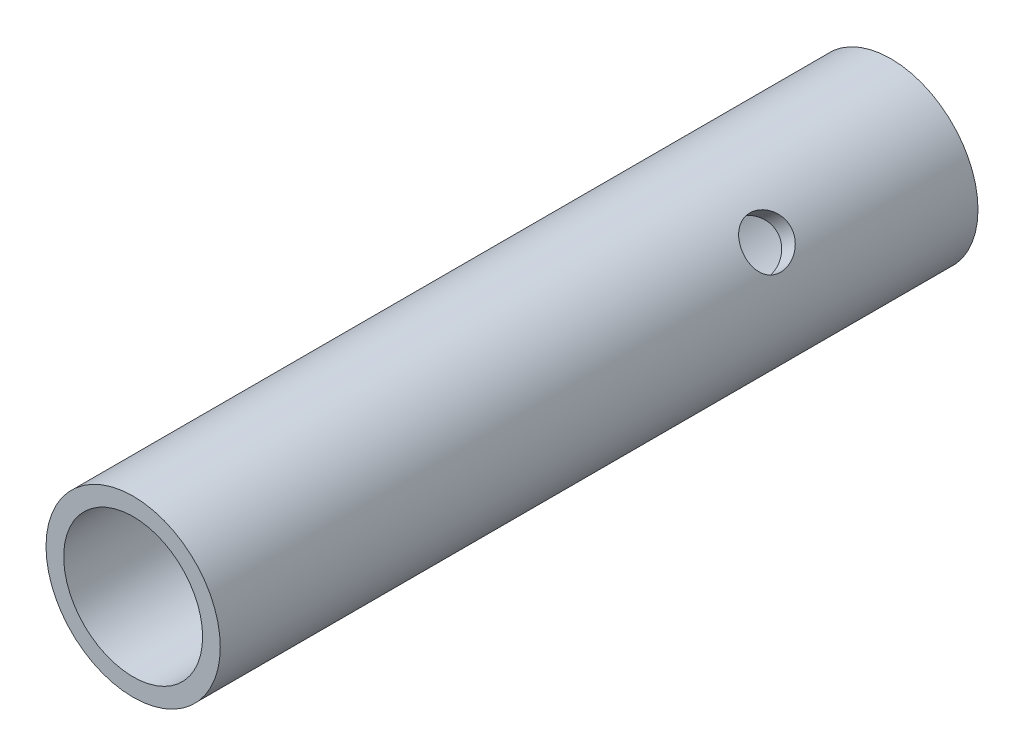
ISO-10303-21;
HEADER;
FILE_DESCRIPTION(('STEP AP214'),'2;1');
FILE_NAME('part.step','',(''),(''),'','','');
FILE_SCHEMA(('AUTOMOTIVE_DESIGN { 1 0 10303 214 1 1 1 1 }'));
ENDSEC;
DATA;
#1=APPLICATION_CONTEXT('core data for automotive mechanical design processes');
#2=APPLICATION_PROTOCOL_DEFINITION('international standard','automotive_design',2000,#1);
#3=PRODUCT_CONTEXT('',#1,'mechanical');
#4=PRODUCT('Part','Part','',(#3));
#5=PRODUCT_RELATED_PRODUCT_CATEGORY('part','',(#4));
#6=PRODUCT_DEFINITION_FORMATION('','',#4);
#7=PRODUCT_DEFINITION_CONTEXT('part definition',#1,'design');
#8=PRODUCT_DEFINITION('design','',#6,#7);
#9=PRODUCT_DEFINITION_SHAPE('','',#8);
#10=(LENGTH_UNIT() NAMED_UNIT(*) SI_UNIT(.MILLI.,.METRE.));
#11=(NAMED_UNIT(*) PLANE_ANGLE_UNIT() SI_UNIT($,.RADIAN.));
#12=(NAMED_UNIT(*) SI_UNIT($,.STERADIAN.) SOLID_ANGLE_UNIT());
#13=UNCERTAINTY_MEASURE_WITH_UNIT(LENGTH_MEASURE(1.E-05),#10,'distance_accuracy_value','');
#14=(GEOMETRIC_REPRESENTATION_CONTEXT(3) GLOBAL_UNCERTAINTY_ASSIGNED_CONTEXT((#13)) GLOBAL_UNIT_ASSIGNED_CONTEXT((#10,
#11,#12)) REPRESENTATION_CONTEXT('',''));
#15=CARTESIAN_POINT('',(0.,0.,0.));
#16=DIRECTION('',(0.,0.,1.));
#17=DIRECTION('',(1.,0.,0.));
#18=AXIS2_PLACEMENT_3D('',#15,#16,#17);
#19=CARTESIAN_POINT('',(0.,0.,76.2));
#20=DIRECTION('',(0.,0.,1.));
#21=DIRECTION('',(1.,0.,0.));
#22=AXIS2_PLACEMENT_3D('',#19,#20,#21);
#23=PLANE('',#22);
#24=CARTESIAN_POINT('',(0.,0.,76.2));
#25=DIRECTION('',(0.,0.,1.));
#26=DIRECTION('',(1.,0.,0.));
#27=AXIS2_PLACEMENT_3D('',#24,#25,#26);
#28=CIRCLE('',#27,17.526);
#29=CARTESIAN_POINT('',(17.526,0.,76.2));
#30=VERTEX_POINT('',#29);
#31=EDGE_CURVE('E10',#30,#30,#28,.T.);
#32=ORIENTED_EDGE('',*,*,#31,.T.);
#33=EDGE_LOOP('',(#32));
#34=FACE_BOUND('',#33,.T.);
#35=CARTESIAN_POINT('',(0.,0.,76.2));
#36=DIRECTION('',(0.,0.,1.));
#37=DIRECTION('',(1.,0.,0.));
#38=AXIS2_PLACEMENT_3D('',#35,#36,#37);
#39=CIRCLE('',#38,13.97);
#40=CARTESIAN_POINT('',(13.97,0.,76.2));
#41=VERTEX_POINT('',#40);
#42=EDGE_CURVE('E56',#41,#41,#39,.T.);
#43=ORIENTED_EDGE('',*,*,#42,.F.);
#44=EDGE_LOOP('',(#43));
#45=FACE_BOUND('',#44,.T.);
#46=ADVANCED_FACE('F37',(#34,#45),#23,.T.);
#47=CARTESIAN_POINT('',(0.,0.,-76.2));
#48=DIRECTION('',(0.,0.,1.));
#49=DIRECTION('',(1.,0.,0.));
#50=AXIS2_PLACEMENT_3D('',#47,#48,#49);
#51=PLANE('',#50);
#52=CARTESIAN_POINT('',(0.,0.,-76.2));
#53=DIRECTION('',(0.,0.,1.));
#54=DIRECTION('',(1.,0.,0.));
#55=AXIS2_PLACEMENT_3D('',#52,#53,#54);
#56=CIRCLE('',#55,17.526);
#57=CARTESIAN_POINT('',(17.526,0.,-76.2));
#58=VERTEX_POINT('',#57);
#59=EDGE_CURVE('E51',#58,#58,#56,.T.);
#60=ORIENTED_EDGE('',*,*,#59,.F.);
#61=EDGE_LOOP('',(#60));
#62=FACE_BOUND('',#61,.T.);
#63=CARTESIAN_POINT('',(0.,0.,-76.2));
#64=DIRECTION('',(0.,0.,1.));
#65=DIRECTION('',(1.,0.,0.));
#66=AXIS2_PLACEMENT_3D('',#63,#64,#65);
#67=CIRCLE('',#66,13.97);
#68=CARTESIAN_POINT('',(13.97,0.,-76.2));
#69=VERTEX_POINT('',#68);
#70=EDGE_CURVE('E59',#69,#69,#67,.T.);
#71=ORIENTED_EDGE('',*,*,#70,.T.);
#72=EDGE_LOOP('',(#71));
#73=FACE_BOUND('',#72,.T.);
#74=ADVANCED_FACE('F95',(#62,#73),#51,.F.);
#75=CARTESIAN_POINT('',(0.,0.,76.2));
#76=DIRECTION('',(0.,0.,-1.));
#77=DIRECTION('',(-1.,0.,0.));
#78=AXIS2_PLACEMENT_3D('',#75,#76,#77);
#79=CYLINDRICAL_SURFACE('',#78,17.526);
#80=CARTESIAN_POINT('',(15.9183936364624,7.3324907115273,-38.1));
#81=CARTESIAN_POINT('',(15.9183930925599,7.33249804726673,-37.8378437978911));
#82=CARTESIAN_POINT('',(15.9089862830615,7.35301934263765,-37.5756256242163));
#83=CARTESIAN_POINT('',(15.8712778914847,7.43405315105421,-37.058775719828));
#84=CARTESIAN_POINT('',(15.8429673022632,7.49458472778479,-36.8041476660481));
#85=CARTESIAN_POINT('',(15.7672929318567,7.65249921997734,-36.310030092278));
#86=CARTESIAN_POINT('',(15.7199566375768,7.74982896024007,-36.0705193071168));
#87=CARTESIAN_POINT('',(15.6059363917525,7.97693580288025,-35.6124304626339));
#88=CARTESIAN_POINT('',(15.5392507268511,8.10671577853537,-35.3938542593179));
#89=CARTESIAN_POINT('',(15.3844543402216,8.39683475617956,-34.978162770671));
#90=CARTESIAN_POINT('',(15.2958774553613,8.5578195575878,-34.78167166091));
#91=CARTESIAN_POINT('',(15.098111566773,8.9020812244723,-34.4212517904443));
#92=CARTESIAN_POINT('',(14.9889203587872,9.08536047311331,-34.2573265158047));
#93=CARTESIAN_POINT('',(14.7484490144502,9.47081311221125,-33.9640732161426));
#94=CARTESIAN_POINT('',(14.61683074508,9.67325071245686,-33.8353680310925));
#95=CARTESIAN_POINT('',(14.3344022715767,10.0870329612848,-33.6202742360598));
#96=CARTESIAN_POINT('',(14.1835954387182,10.2983760408948,-33.5338782055997));
#97=CARTESIAN_POINT('',(13.8695068978694,10.7174797313864,-33.4078818817753));
#98=CARTESIAN_POINT('',(13.70660636971,10.9252062687496,-33.367219276647));
#99=CARTESIAN_POINT('',(13.3694508150897,11.3352930819606,-33.3304994009825));
#100=CARTESIAN_POINT('',(13.1951977644256,11.5376542830134,-33.3344343891762));
#101=CARTESIAN_POINT('',(12.8453087580261,11.925823055095,-33.3860549823937));
#102=CARTESIAN_POINT('',(12.6698284415438,12.111925305076,-33.4325924863652));
#103=CARTESIAN_POINT('',(12.3187684184122,12.4688137192662,-33.5662393010781));
#104=CARTESIAN_POINT('',(12.1431887065807,12.6395989930059,-33.6533509688229));
#105=CARTESIAN_POINT('',(11.7961266218812,12.9641486343006,-33.8665380792009));
#106=CARTESIAN_POINT('',(11.6247043607233,13.117721482505,-33.9930021387805));
#107=CARTESIAN_POINT('',(11.2939589922412,13.4035449682525,-34.2810046917972));
#108=CARTESIAN_POINT('',(11.1346383298484,13.5357913031492,-34.4425502475744));
#109=CARTESIAN_POINT('',(10.8292995474938,13.7813860395458,-34.8022050621307));
#110=CARTESIAN_POINT('',(10.6838666344086,13.8939985018782,-35.0013148900933));
#111=CARTESIAN_POINT('',(10.4185299245743,14.0940625865761,-35.4272934028381));
#112=CARTESIAN_POINT('',(10.2986278105627,14.1815125506122,-35.654163915779));
#113=CARTESIAN_POINT('',(10.0893819345668,14.3311471706364,-36.1313237616136));
#114=CARTESIAN_POINT('',(10.0002456058712,14.3931608345404,-36.3817581099169));
#115=CARTESIAN_POINT('',(9.85848572920605,14.4906320901624,-36.8976685190607));
#116=CARTESIAN_POINT('',(9.80585272472451,14.5260965598752,-37.1631406649347));
#117=CARTESIAN_POINT('',(9.74119760446328,14.5695307437977,-37.6927798924451));
#118=CARTESIAN_POINT('',(9.72796829496044,14.5783179260155,-37.9567327841688));
#119=CARTESIAN_POINT('',(9.73945024401791,14.57064979889,-38.4834228946849));
#120=CARTESIAN_POINT('',(9.76415728760375,14.5541972938396,-38.7461602452787));
#121=CARTESIAN_POINT('',(9.84920025424071,14.4967736642865,-39.2574819443664));
#122=CARTESIAN_POINT('',(9.90880821521915,14.4563032759219,-39.5062447994075));
#123=CARTESIAN_POINT('',(10.0599432522998,14.3515371307781,-39.9885826279048));
#124=CARTESIAN_POINT('',(10.1514746137993,14.2872381751794,-40.2221555572681));
#125=CARTESIAN_POINT('',(10.3645082807385,14.1334788397426,-40.673340331469));
#126=CARTESIAN_POINT('',(10.4866440263067,14.0434801999501,-40.8904692292676));
#127=CARTESIAN_POINT('',(10.7543233530748,13.8395613984205,-41.2973666249077));
#128=CARTESIAN_POINT('',(10.8998715089986,13.7256365602345,-41.4871297617795));
#129=CARTESIAN_POINT('',(11.2131435468648,13.4710047824933,-41.8397888945986));
#130=CARTESIAN_POINT('',(11.3814037577584,13.3295938673013,-42.0017022404634));
#131=CARTESIAN_POINT('',(11.729746472431,13.0241049064826,-42.2868415336025));
#132=CARTESIAN_POINT('',(11.9098283463974,12.8600280678954,-42.4100695398633));
#133=CARTESIAN_POINT('',(12.2735021402586,12.5133681429581,-42.6131942235508));
#134=CARTESIAN_POINT('',(12.4570564585005,12.3309369387468,-42.6934165680787));
#135=CARTESIAN_POINT('',(12.8222898448482,11.9506889237087,-42.8091852102612));
#136=CARTESIAN_POINT('',(13.0039693361337,11.7528756748916,-42.8447418186073));
#137=CARTESIAN_POINT('',(13.3536245482179,11.3538337356235,-42.8695031944559));
#138=CARTESIAN_POINT('',(13.5218523666693,11.1529139860975,-42.8601468022094));
#139=CARTESIAN_POINT('',(13.8460564413466,10.7477771326337,-42.7987029449635));
#140=CARTESIAN_POINT('',(14.0020331891806,10.5435601614028,-42.7466171955586));
#141=CARTESIAN_POINT('',(14.2970963799017,10.1398141309352,-42.6020190396732));
#142=CARTESIAN_POINT('',(14.4362992084145,9.94026157108096,-42.5098084693656));
#143=CARTESIAN_POINT('',(14.6969476087032,9.5506756543249,-42.2878470790421));
#144=CARTESIAN_POINT('',(14.8183906140492,9.36064367582311,-42.1580908414447));
#145=CARTESIAN_POINT('',(15.0454369596559,8.99131926609367,-41.8605660590497));
#146=CARTESIAN_POINT('',(15.1505132067068,8.81246556524288,-41.6918507686252));
#147=CARTESIAN_POINT('',(15.3403086113767,8.47777702707109,-41.322979317669));
#148=CARTESIAN_POINT('',(15.4250223363052,8.32194833705154,-41.1228147900307));
#149=CARTESIAN_POINT('',(15.5758961728976,8.03610081620908,-40.691169981549));
#150=CARTESIAN_POINT('',(15.6415829093265,7.9067607317608,-40.4590735266045));
#151=CARTESIAN_POINT('',(15.7520192230255,7.68440500456603,-39.9735702620458));
#152=CARTESIAN_POINT('',(15.7967819944713,7.59136647701986,-39.7201770009821));
#153=CARTESIAN_POINT('',(15.8603632219613,7.45748821099668,-39.2399056188357));
#154=CARTESIAN_POINT('',(15.8821343849684,7.41077982206922,-39.0150347299666));
#155=CARTESIAN_POINT('',(15.9111489271635,7.34827977641355,-38.5601247085962));
#156=CARTESIAN_POINT('',(15.9183941138284,7.33248427318039,-38.3300862227048));
#157=CARTESIAN_POINT('',(15.9183936364624,7.3324907115273,-38.1));
#158=B_SPLINE_CURVE_WITH_KNOTS('',3,(#80,#81,#82,#83,#84,#85,#86,#87,#88,#89,#90,#91,#92,#93,
#94,#95,#96,#97,#98,#99,#100,#101,#102,#103,#104,#105,#106,#107,#108,#109,#110,#111,#112,#113,
#114,#115,#116,#117,#118,#119,#120,#121,#122,#123,#124,#125,#126,#127,#128,#129,#130,#131,#132,
#133,#134,#135,#136,#137,#138,#139,#140,#141,#142,#143,#144,#145,#146,#147,#148,#149,#150,#151,
#152,#153,#154,#155,#156,#157),.UNSPECIFIED.,.T.,.F.,(4,2,2,2,2,2,2,2,2,2,2,2,2,2,2,2,2,2,2,2,2,
2,2,2,2,2,2,2,2,2,2,2,2,2,2,2,2,2,4),(0.,0.785622172128231,1.57161893947477,2.35648421637042,
3.14141901309959,3.94477838506352,4.74822370770946,5.56507350958325,6.38177999523481,
7.17909647826568,7.97627456487042,8.75258229535404,9.52893512814109,10.3132119696007,
11.0976468423123,11.9070627021408,12.7165318941482,13.5313568098582,14.3459705589724,
15.135356658809,15.9246550590849,16.6980489126388,17.4715466265703,18.2626106758859,
19.0538294852347,19.8689057478766,20.6839386215878,21.4927090772019,22.3012928009558,
23.0841487444215,23.8669732575597,24.6440081624142,25.4211552440202,26.2196621753778,
27.0183819113104,27.8355372362222,28.6521765841629,29.3417781766106,30.03129395615),.UNSPECIFIED.);
#159=CARTESIAN_POINT('',(15.9183936364624,7.3324907115273,-38.1));
#160=VERTEX_POINT('',#159);
#161=EDGE_CURVE('E84',#160,#160,#158,.T.);
#162=ORIENTED_EDGE('',*,*,#161,.T.);
#163=EDGE_LOOP('',(#162));
#164=FACE_BOUND('',#163,.T.);
#165=CARTESIAN_POINT('',(-9.73240097611734,-14.5753575338676,-38.1));
#166=CARTESIAN_POINT('',(-9.73240813645656,-14.575355849099,-38.3621562021088));
#167=CARTESIAN_POINT('',(-9.75120523141671,-14.562854615172,-38.6243743757836));
#168=CARTESIAN_POINT('',(-9.8253424871199,-14.5129339959991,-39.1412242801719));
#169=CARTESIAN_POINT('',(-9.88070006781468,-14.4755027322857,-39.3958523339518));
#170=CARTESIAN_POINT('',(-10.0248322909125,-14.3760567698452,-39.8899699077219));
#171=CARTESIAN_POINT('',(-10.1135587126905,-14.3140775380474,-40.1294806928831));
#172=CARTESIAN_POINT('',(-10.3200327970763,-14.1659337332195,-40.587569537366));
#173=CARTESIAN_POINT('',(-10.4377830295589,-14.0797670184471,-40.806145740682));
#174=CARTESIAN_POINT('',(-10.7001146712308,-13.8814918251411,-41.2218372293289));
#175=CARTESIAN_POINT('',(-10.8452610049968,-13.7688218974304,-41.41832833909));
#176=CARTESIAN_POINT('',(-11.1543468385079,-13.5196364454114,-41.7787482095556));
#177=CARTESIAN_POINT('',(-11.3182883472553,-13.3831183711742,-41.9426734841952));
#178=CARTESIAN_POINT('',(-11.6613774186351,-13.0853095507296,-42.2359267838574));
#179=CARTESIAN_POINT('',(-11.8407330425373,-12.923643502965,-42.3646319689074));
#180=CARTESIAN_POINT('',(-12.2052393980853,-12.5799623878951,-42.5797257639402));
#181=CARTESIAN_POINT('',(-12.3903891074589,-12.3979508958,-42.6661217944002));
#182=CARTESIAN_POINT('',(-12.7551986631949,-12.0221670444707,-42.7921181182247));
#183=CARTESIAN_POINT('',(-12.9348844852034,-11.8287765023837,-42.8327807233529));
#184=CARTESIAN_POINT('',(-13.2871797004213,-11.4316201808737,-42.8695005990175));
#185=CARTESIAN_POINT('',(-13.4597903165278,-11.227856208188,-42.8655656108237));
#186=CARTESIAN_POINT('',(-13.7884453873564,-10.8215519418589,-42.8139450176063));
#187=CARTESIAN_POINT('',(-13.9448052403871,-10.6191192733468,-42.7674075136348));
#188=CARTESIAN_POINT('',(-14.2423818790606,-10.2165517334977,-42.6337606989219));
#189=CARTESIAN_POINT('',(-14.3835977843864,-10.0164169963426,-42.546649031177));
#190=CARTESIAN_POINT('',(-14.6498592094817,-9.62285707230725,-42.333461920799));
#191=CARTESIAN_POINT('',(-14.774724971365,-9.42952121728958,-42.2069978612195));
#192=CARTESIAN_POINT('',(-15.0052895209231,-9.05813522904516,-41.9189953082027));
#193=CARTESIAN_POINT('',(-15.1109844413957,-8.88008818373082,-41.7574497524256));
#194=CARTESIAN_POINT('',(-15.3057899899725,-8.54008914726271,-41.3977949378693));
#195=CARTESIAN_POINT('',(-15.3942652860662,-8.37883028436785,-41.1986851099066));
#196=CARTESIAN_POINT('',(-15.5503584436357,-8.08546339166913,-40.7727065971618));
#197=CARTESIAN_POINT('',(-15.617974930437,-7.95335728330539,-40.5458360842209));
#198=CARTESIAN_POINT('',(-15.733034033311,-7.72327955953166,-40.0686762383864));
#199=CARTESIAN_POINT('',(-15.7803402122115,-7.62553957261753,-39.818241890083));
#200=CARTESIAN_POINT('',(-15.8544353044622,-7.47027713154116,-39.3023314809392));
#201=CARTESIAN_POINT('',(-15.8812295318034,-7.41274426133679,-39.0368593350652));
#202=CARTESIAN_POINT('',(-15.9140146796968,-7.34209054956862,-38.5072201075549));
#203=CARTESIAN_POINT('',(-15.920624157165,-7.3276494966691,-38.2432672158311));
#204=CARTESIAN_POINT('',(-15.9148466099674,-7.34018964324521,-37.7165771053151));
#205=CARTESIAN_POINT('',(-15.9024616957016,-7.36716624095165,-37.4538397547212));
#206=CARTESIAN_POINT('',(-15.8590486973086,-7.4601452223184,-36.9425180556335));
#207=CARTESIAN_POINT('',(-15.8284013060694,-7.52535027393724,-36.6937552005924));
#208=CARTESIAN_POINT('',(-15.7485677346962,-7.69101362378711,-36.2114173720952));
#209=CARTESIAN_POINT('',(-15.6993790655095,-7.79147665506074,-35.9778444427318));
#210=CARTESIAN_POINT('',(-15.5808385703641,-8.02594078343482,-35.5266596685309));
#211=CARTESIAN_POINT('',(-15.5110542031919,-8.16065172437268,-35.3095307707323));
#212=CARTESIAN_POINT('',(-15.3515202527783,-8.45693540306883,-34.9026333750923));
#213=CARTESIAN_POINT('',(-15.2617667663073,-8.61851339078632,-34.7128702382204));
#214=CARTESIAN_POINT('',(-15.059276471943,-8.96776171595439,-34.3602111054013));
#215=CARTESIAN_POINT('',(-14.9459282558536,-9.15607190530902,-34.1982977595366));
#216=CARTESIAN_POINT('',(-14.698693177293,-9.54791494528376,-33.9131584663974));
#217=CARTESIAN_POINT('',(-14.5648074084761,-9.75144698502277,-33.7899304601367));
#218=CARTESIAN_POINT('',(-14.2793065578557,-10.1648729109079,-33.5868057764491));
#219=CARTESIAN_POINT('',(-14.1278356060755,-10.3747058987387,-33.5065834319212));
#220=CARTESIAN_POINT('',(-13.8094041644961,-10.7949265508455,-33.3908147897387));
#221=CARTESIAN_POINT('',(-13.6424472590521,-11.0053140758701,-33.3552581813926));
#222=CARTESIAN_POINT('',(-13.3030163142795,-11.413088364372,-33.330496805544));
#223=CARTESIAN_POINT('',(-13.1308868490617,-11.6106757927533,-33.3398531977905));
#224=CARTESIAN_POINT('',(-12.7814545935361,-11.9942657442252,-33.4012970550364));
#225=CARTESIAN_POINT('',(-12.6041520112059,-12.1802687321114,-33.4533828044413));
#226=CARTESIAN_POINT('',(-12.251534816745,-12.5348589996138,-33.5979809603267));
#227=CARTESIAN_POINT('',(-12.0762152000515,-12.7035649082619,-33.6901915306343));
#228=CARTESIAN_POINT('',(-11.7322001254742,-13.0219489586968,-33.9121529209578));
#229=CARTESIAN_POINT('',(-11.5635056275419,-13.1716243500213,-34.0419091585553));
#230=CARTESIAN_POINT('',(-11.2342460877693,-13.4536504448141,-34.3394339409502));
#231=CARTESIAN_POINT('',(-11.0740319192625,-13.5854119119128,-34.5081492313748));
#232=CARTESIAN_POINT('',(-10.7731544949761,-13.8252274426278,-34.8770206823309));
#233=CARTESIAN_POINT('',(-10.6324964609543,-13.9332751787892,-35.0771852099692));
#234=CARTESIAN_POINT('',(-10.3737700653461,-14.1270079120985,-35.5088300184509));
#235=CARTESIAN_POINT('',(-10.2562980414384,-14.21211918272,-35.7409264733954));
#236=CARTESIAN_POINT('',(-10.0539559278781,-14.3559799413711,-36.2264297379541));
#237=CARTESIAN_POINT('',(-9.96906529919944,-14.4147460411057,-36.4798229990178));
#238=CARTESIAN_POINT('',(-9.84678159209824,-14.4984876531041,-36.9600943811642));
#239=CARTESIAN_POINT('',(-9.80405402118492,-14.5272975788021,-37.1849652700333));
#240=CARTESIAN_POINT('',(-9.74686232919083,-14.5657320650431,-37.6398752914038));
#241=CARTESIAN_POINT('',(-9.73239469171365,-14.5753590125358,-37.8699137772951));
#242=CARTESIAN_POINT('',(-9.73240097611734,-14.5753575338676,-38.1));
#243=B_SPLINE_CURVE_WITH_KNOTS('',3,(#165,#166,#167,#168,#169,#170,#171,#172,#173,#174,#175,
#176,#177,#178,#179,#180,#181,#182,#183,#184,#185,#186,#187,#188,#189,#190,#191,#192,#193,#194,
#195,#196,#197,#198,#199,#200,#201,#202,#203,#204,#205,#206,#207,#208,#209,#210,#211,#212,#213,
#214,#215,#216,#217,#218,#219,#220,#221,#222,#223,#224,#225,#226,#227,#228,#229,#230,#231,#232,
#233,#234,#235,#236,#237,#238,#239,#240,#241,#242),.UNSPECIFIED.,.T.,.F.,(4,2,2,2,2,2,2,2,2,2,2,
2,2,2,2,2,2,2,2,2,2,2,2,2,2,2,2,2,2,2,2,2,2,2,2,2,2,2,4),(0.,0.785622172128231,1.57161893947476,
2.35648421637041,3.14141901309958,3.94477838506351,4.74822370770945,5.56507350958324,
6.3817799952348,7.17909647826567,7.97627456487042,8.75258229535404,9.52893512814109,
10.3132119696007,11.0976468423123,11.9070627021408,12.7165318941482,13.5313568098582,
14.3459705589724,15.135356658809,15.9246550590849,16.6980489126388,17.4715466265703,
18.2626106758859,19.0538294852347,19.8689057478766,20.6839386215878,21.4927090772019,
22.3012928009558,23.0841487444215,23.8669732575597,24.6440081624142,25.4211552440203,
26.2196621753778,27.0183819113104,27.8355372362222,28.6521765841629,29.3417781766106,
30.03129395615),.UNSPECIFIED.);
#244=CARTESIAN_POINT('',(-9.73240097611734,-14.5753575338676,-38.1));
#245=VERTEX_POINT('',#244);
#246=EDGE_CURVE('E79',#245,#245,#243,.T.);
#247=ORIENTED_EDGE('',*,*,#246,.T.);
#248=EDGE_LOOP('',(#247));
#249=FACE_BOUND('',#248,.T.);
#250=ORIENTED_EDGE('',*,*,#31,.F.);
#251=EDGE_LOOP('',(#250));
#252=FACE_BOUND('',#251,.T.);
#253=ORIENTED_EDGE('',*,*,#59,.T.);
#254=EDGE_LOOP('',(#253));
#255=FACE_BOUND('',#254,.T.);
#256=ADVANCED_FACE('F39',(#164,#249,#252,#255),#79,.T.);
#257=CARTESIAN_POINT('',(0.,0.,76.2));
#258=DIRECTION('',(0.,0.,-1.));
#259=DIRECTION('',(-1.,0.,0.));
#260=AXIS2_PLACEMENT_3D('',#257,#258,#259);
#261=CYLINDRICAL_SURFACE('',#260,13.97);
#262=CARTESIAN_POINT('',(13.0795180240655,4.90786188254582,-38.1));
#263=CARTESIAN_POINT('',(13.0795181384857,4.90785869842513,-37.840975304146));
#264=CARTESIAN_POINT('',(13.0716383636729,4.92901604657011,-37.5819676511446));
#265=CARTESIAN_POINT('',(13.0399136670333,5.01233449232098,-37.0716497144733));
#266=CARTESIAN_POINT('',(13.0160667147688,5.07450080474391,-36.8203404140016));
#267=CARTESIAN_POINT('',(12.9518848091397,5.23612934026417,-36.3328993972462));
#268=CARTESIAN_POINT('',(12.9115833708919,5.33551571827749,-36.096737952012));
#269=CARTESIAN_POINT('',(12.8136143856896,5.56667673890201,-35.6447570839763));
#270=CARTESIAN_POINT('',(12.7559427374728,5.69845902912643,-35.4289424810649));
#271=CARTESIAN_POINT('',(12.6197312378774,5.99422248629337,-35.0149445451402));
#272=CARTESIAN_POINT('',(12.5404951477799,6.15921874796897,-34.8177152400715));
#273=CARTESIAN_POINT('',(12.3612600512734,6.51146347480655,-34.4550721401567));
#274=CARTESIAN_POINT('',(12.2612575410446,6.69871569282785,-34.2896637233832));
#275=CARTESIAN_POINT('',(12.0369952925339,7.09398318929976,-33.9909832057697));
#276=CARTESIAN_POINT('',(11.9121453551936,7.3024271457112,-33.8587172023614));
#277=CARTESIAN_POINT('',(11.6407504846791,7.72769918909804,-33.636745928457));
#278=CARTESIAN_POINT('',(11.4942117005257,7.94452488692905,-33.5470286251589));
#279=CARTESIAN_POINT('',(11.1875152252995,8.37058953170379,-33.4159557983863));
#280=CARTESIAN_POINT('',(11.0280440763264,8.57981847665385,-33.3729645442078));
#281=CARTESIAN_POINT('',(10.6951116287055,8.99141102655085,-33.3313561893216));
#282=CARTESIAN_POINT('',(10.5216541106626,9.19377646587602,-33.3327271370699));
#283=CARTESIAN_POINT('',(10.1735015059533,9.57732484617345,-33.3787814446329));
#284=CARTESIAN_POINT('',(9.9991487396251,9.75903609266237,-33.4216866967843));
#285=CARTESIAN_POINT('',(9.64824205179349,10.1061000785525,-33.5466424895319));
#286=CARTESIAN_POINT('',(9.47168798026511,10.2714516960622,-33.6286957125283));
#287=CARTESIAN_POINT('',(9.12006040591575,10.5849742504864,-33.8306181770824));
#288=CARTESIAN_POINT('',(8.94503871370274,10.7328843409564,-33.9509809596907));
#289=CARTESIAN_POINT('',(8.60515091607815,11.0072730642877,-34.2256944640482));
#290=CARTESIAN_POINT('',(8.44028774112921,11.1337455312154,-34.3800549350281));
#291=CARTESIAN_POINT('',(8.11915052646798,11.3702252044513,-34.7272759531375));
#292=CARTESIAN_POINT('',(7.96369575677768,11.4791189608219,-34.921654804725));
#293=CARTESIAN_POINT('',(7.67760559697513,11.6724099732967,-35.338856553657));
#294=CARTESIAN_POINT('',(7.54697440751229,11.7568030846715,-35.5616842544724));
#295=CARTESIAN_POINT('',(7.31536580786201,11.9023272910071,-36.034010391233));
#296=CARTESIAN_POINT('',(7.21487992309054,11.9630771594529,-36.2838689868528));
#297=CARTESIAN_POINT('',(7.05251967074379,12.0595144728547,-36.8003879055179));
#298=CARTESIAN_POINT('',(6.99062822483275,12.0952130040976,-37.0670407393886));
#299=CARTESIAN_POINT('',(6.91161685115811,12.1405288927162,-37.5961722513041));
#300=CARTESIAN_POINT('',(6.89253180917128,12.15129179018,-37.8582593800505));
#301=CARTESIAN_POINT('',(6.89459839796671,12.1501205277459,-38.3821944705114));
#302=CARTESIAN_POINT('',(6.91574228283377,12.1381907372322,-38.6440424685573));
#303=CARTESIAN_POINT('',(6.99530653558064,12.0924990936451,-39.1500913041227));
#304=CARTESIAN_POINT('',(7.05233798354059,12.0595500975101,-39.3945874099769));
#305=CARTESIAN_POINT('',(7.19900796034679,11.9725688029983,-39.869631424132));
#306=CARTESIAN_POINT('',(7.28865243492865,11.9185326600577,-40.1001767801036));
#307=CARTESIAN_POINT('',(7.49930552798563,11.7871609892849,-40.5491616114622));
#308=CARTESIAN_POINT('',(7.62124659787246,11.7091192591247,-40.7669558231157));
#309=CARTESIAN_POINT('',(7.88914469229824,11.530316233185,-41.1769800157067));
#310=CARTESIAN_POINT('',(8.03510910503887,11.4295479444785,-41.3692020991353));
#311=CARTESIAN_POINT('',(8.35281263207695,11.1996302943016,-41.7327037453815));
#312=CARTESIAN_POINT('',(8.52548325454765,11.0693011507375,-41.9024276721531));
#313=CARTESIAN_POINT('',(8.88328800152309,10.7842633951712,-42.2041339494791));
#314=CARTESIAN_POINT('',(9.06842174668495,10.6295555249979,-42.3361174481062));
#315=CARTESIAN_POINT('',(9.44250952787903,10.298631846609,-42.5574277485636));
#316=CARTESIAN_POINT('',(9.63143250208417,10.1225563274971,-42.6470156863694));
#317=CARTESIAN_POINT('',(10.0067729477843,9.75166030650997,-42.7813754695941));
#318=CARTESIAN_POINT('',(10.1931913435646,9.55684694895568,-42.8261643222412));
#319=CARTESIAN_POINT('',(10.547713630889,9.16369343631666,-42.8680690511148));
#320=CARTESIAN_POINT('',(10.7162673427829,8.9659939479098,-42.8674135693791));
#321=CARTESIAN_POINT('',(11.0399091810075,8.56433357525582,-42.8239867150781));
#322=CARTESIAN_POINT('',(11.1949984843001,8.36037324040091,-42.7812190277012));
#323=CARTESIAN_POINT('',(11.4855931007338,7.95631703188937,-42.6562790702642));
#324=CARTESIAN_POINT('',(11.6213901163139,7.75621519332491,-42.574799333926));
#325=CARTESIAN_POINT('',(11.8746200091318,7.36268384777344,-42.3753967172282));
#326=CARTESIAN_POINT('',(11.9920495114895,7.169255572076,-42.2574671513298));
#327=CARTESIAN_POINT('',(12.211964647791,6.78815710069407,-41.9833656439372));
#328=CARTESIAN_POINT('',(12.3137132375881,6.60098468731713,-41.825911262244));
#329=CARTESIAN_POINT('',(12.4969957352194,6.24706264740887,-41.4793820309373));
#330=CARTESIAN_POINT('',(12.5785230233639,6.08031971773377,-41.2902968604291));
#331=CARTESIAN_POINT('',(12.7252031273051,5.76725793917591,-40.8765058578721));
#332=CARTESIAN_POINT('',(12.7895366321173,5.62207291509981,-40.6506479715889));
#333=CARTESIAN_POINT('',(12.8983916478086,5.36764685739243,-40.1751399073649));
#334=CARTESIAN_POINT('',(12.9429171896873,5.258398511684,-39.9254945828298));
#335=CARTESIAN_POINT('',(13.0121984445146,5.08450129618396,-39.4169706346319));
#336=CARTESIAN_POINT('',(13.0375060175503,5.01861535072158,-39.1585920470227));
#337=CARTESIAN_POINT('',(13.0711624479696,4.93030574168761,-38.633467417236));
#338=CARTESIAN_POINT('',(13.0795179062439,4.90786516132026,-38.3667246730319));
#339=CARTESIAN_POINT('',(13.0795180240655,4.90786188254582,-38.1));
#340=B_SPLINE_CURVE_WITH_KNOTS('',3,(#262,#263,#264,#265,#266,#267,#268,#269,#270,#271,#272,
#273,#274,#275,#276,#277,#278,#279,#280,#281,#282,#283,#284,#285,#286,#287,#288,#289,#290,#291,
#292,#293,#294,#295,#296,#297,#298,#299,#300,#301,#302,#303,#304,#305,#306,#307,#308,#309,#310,
#311,#312,#313,#314,#315,#316,#317,#318,#319,#320,#321,#322,#323,#324,#325,#326,#327,#328,#329,
#330,#331,#332,#333,#334,#335,#336,#337,#338,#339),.UNSPECIFIED.,.T.,.F.,(4,2,2,2,2,2,2,2,2,2,2,
2,2,2,2,2,2,2,2,2,2,2,2,2,2,2,2,2,2,2,2,2,2,2,2,2,2,2,4),(0.,0.776085398862082,1.55226950598971,
2.32688047710962,3.10167448439042,3.90527913998097,4.70901949431333,5.53480925854626,
6.36036534939606,7.15598496640281,7.95139023868933,8.71418400095019,9.4770300369809,
10.250131194356,11.0234543367573,11.8347504445687,12.6461837179938,13.4702064295547,
14.2938642454967,15.0788614974737,15.8637076167391,16.6199036310018,17.3762375777725,
18.157383747913,18.9387706042423,19.7597688520946,20.5807421223262,21.3965905713146,
22.2121291793046,22.9877025474702,23.7632080521752,24.5253345956605,25.2876010095742,
26.0788210574689,26.8702997800476,27.6946029784843,28.5187383511088,29.3182056509097,
30.1173615907475),.UNSPECIFIED.);
#341=CARTESIAN_POINT('',(13.0795180240655,4.90786188254582,-38.1));
#342=VERTEX_POINT('',#341);
#343=EDGE_CURVE('E42',#342,#342,#340,.T.);
#344=ORIENTED_EDGE('',*,*,#343,.F.);
#345=EDGE_LOOP('',(#344));
#346=FACE_BOUND('',#345,.T.);
#347=CARTESIAN_POINT('',(-6.89352536372045,-12.1507287048861,-38.1));
#348=CARTESIAN_POINT('',(-6.89352223670083,-12.1507293160038,-38.3590246958539));
#349=CARTESIAN_POINT('',(-6.91318643442406,-12.139636815856,-38.6180323488554));
#350=CARTESIAN_POINT('',(-6.99051625590131,-12.0952688263871,-39.1283502855266));
#351=CARTESIAN_POINT('',(-7.04818671263889,-12.0619905158493,-39.3796595859983));
#352=CARTESIAN_POINT('',(-7.19778507060737,-11.9733145224929,-39.8671006027538));
#353=CARTESIAN_POINT('',(-7.28964330345247,-11.9179618069496,-40.103262047988));
#354=CARTESIAN_POINT('',(-7.50263262253272,-11.7850374319258,-40.5552429160236));
#355=CARTESIAN_POINT('',(-7.62377062064752,-11.7074605253261,-40.771057518935));
#356=CARTESIAN_POINT('',(-7.89458456579389,-11.5266584171204,-41.1850554548597));
#357=CARTESIAN_POINT('',(-8.04515419432637,-11.4225867528479,-41.3822847599285));
#358=CARTESIAN_POINT('',(-8.36502365762155,-11.190455122397,-41.7449278598432));
#359=CARTESIAN_POINT('',(-8.53432665092145,-11.06239110846,-41.9103362766168));
#360=CARTESIAN_POINT('',(-8.88964540372849,-10.7790564410119,-42.2090167942302));
#361=CARTESIAN_POINT('',(-9.07599223598545,-10.6231357947647,-42.3412827976385));
#362=CARTESIAN_POINT('',(-9.4535729634361,-10.2885550408564,-42.563254071543));
#363=CARTESIAN_POINT('',(-9.64480546081852,-10.109901380256,-42.6529713748411));
#364=CARTESIAN_POINT('',(-10.0176466437706,-9.74032965279553,-42.7840442016136));
#365=CARTESIAN_POINT('',(-10.1993528493339,-9.55009124021934,-42.8270354557921));
#366=CARTESIAN_POINT('',(-10.5537959026048,-9.15687048314068,-42.8686438106783));
#367=CARTESIAN_POINT('',(-10.7265351535235,-8.95389158573772,-42.8672728629301));
#368=CARTESIAN_POINT('',(-11.0508983503273,-8.5500251316296,-42.821218555367));
#369=CARTESIAN_POINT('',(-11.2030976481106,-8.34939303554045,-42.7783133032156));
#370=CARTESIAN_POINT('',(-11.4909948004248,-7.94851382236486,-42.653357510468));
#371=CARTESIAN_POINT('',(-11.6266915234075,-7.74826673260302,-42.5713042874717));
#372=CARTESIAN_POINT('',(-11.8813474234392,-7.351922544107,-42.3693818229176));
#373=CARTESIAN_POINT('',(-12.0000570704609,-7.15591742348026,-42.2490190403092));
#374=CARTESIAN_POINT('',(-12.2178974474909,-6.77729035550849,-41.9743055359517));
#375=CARTESIAN_POINT('',(-12.3170225459038,-6.59467226711177,-41.8199450649718));
#376=CARTESIAN_POINT('',(-12.5003538335666,-6.24049521328413,-41.4727240468624));
#377=CARTESIAN_POINT('',(-12.583588443363,-6.06991961324706,-41.2783451952749));
#378=CARTESIAN_POINT('',(-12.7297453616242,-5.75711432191751,-40.8611434463429));
#379=CARTESIAN_POINT('',(-12.7926642335145,-5.61488942793599,-40.6383157455276));
#380=CARTESIAN_POINT('',(-12.9001652280014,-5.36336731311134,-40.165989608767));
#381=CARTESIAN_POINT('',(-12.9444477091297,-5.25461520315657,-39.9161310131471));
#382=CARTESIAN_POINT('',(-13.0142989799553,-5.07916775540569,-39.399612094482));
#383=CARTESIAN_POINT('',(-13.0398760478087,-5.01245381525906,-39.1329592606113));
#384=CARTESIAN_POINT('',(-13.0722739206681,-4.92732623591234,-38.6038277486958));
#385=CARTESIAN_POINT('',(-13.0799187506707,-4.90679247435516,-38.3417406199495));
#386=CARTESIAN_POINT('',(-13.0790851941333,-4.90901684582551,-37.8178055294886));
#387=CARTESIAN_POINT('',(-13.0706099114553,-4.93176664478064,-37.5559575314427));
#388=CARTESIAN_POINT('',(-13.0379273991365,-5.01749907736825,-37.0499086958772));
#389=CARTESIAN_POINT('',(-13.0143057438717,-5.07898273214954,-36.805412590023));
#390=CARTESIAN_POINT('',(-12.9513395727916,-5.23745383043184,-36.330368575868));
#391=CARTESIAN_POINT('',(-12.9119921898636,-5.33444774788887,-36.0998232198964));
#392=CARTESIAN_POINT('',(-12.8151913262782,-5.56305840885034,-35.6508383885377));
#393=CARTESIAN_POINT('',(-12.7571862053533,-5.69570659812567,-35.4330441768842));
#394=CARTESIAN_POINT('',(-12.6224930364563,-5.98827737816812,-35.0230199842932));
#395=CARTESIAN_POINT('',(-12.5457992374212,-6.14820836011067,-34.8307979008647));
#396=CARTESIAN_POINT('',(-12.368412036338,-6.49796747414086,-34.4672962546184));
#397=CARTESIAN_POINT('',(-12.2666990972543,-6.68890020457109,-34.2975723278468));
#398=CARTESIAN_POINT('',(-12.041143623634,-7.08688951017661,-33.9958660505209));
#399=CARTESIAN_POINT('',(-11.9173017624509,-7.29394559463176,-33.8638825518938));
#400=CARTESIAN_POINT('',(-11.6489725256085,-7.71519560307417,-33.6425722514364));
#401=CARTESIAN_POINT('',(-11.504618852721,-7.92933690160609,-33.5529843136305));
#402=CARTESIAN_POINT('',(-11.1970053590499,-8.35807720420655,-33.4186245304059));
#403=CARTESIAN_POINT('',(-11.0337527392189,-8.57267600356292,-33.3738356777587));
#404=CARTESIAN_POINT('',(-10.7008991030837,-8.98433629266271,-33.3319309488851));
#405=CARTESIAN_POINT('',(-10.5320012331933,-9.18174184237202,-33.3325864306209));
#406=CARTESIAN_POINT('',(-10.1859147040712,-9.56423263803917,-33.3760132849219));
#407=CARTESIAN_POINT('',(-10.0087267715851,-9.74931896052475,-33.4187809722987));
#408=CARTESIAN_POINT('',(-9.6551041788586,-10.0995441918407,-33.5437209297357));
#409=CARTESIAN_POINT('',(-9.47870925946316,-10.2649721448862,-33.6252006660739));
#410=CARTESIAN_POINT('',(-9.12963682061842,-10.5766462230305,-33.8246032827717));
#411=CARTESIAN_POINT('',(-8.95695998935191,-10.7228888221835,-33.9425328486701));
#412=CARTESIAN_POINT('',(-8.61495577925091,-10.9997133737271,-34.2166343560627));
#413=CARTESIAN_POINT('',(-8.44600475509096,-11.1294894858986,-34.3740887377559));
#414=CARTESIAN_POINT('',(-8.12511178226212,-11.3658810768232,-34.7206179690627));
#415=CARTESIAN_POINT('',(-7.97317541245242,-11.4724889697669,-34.9097031395709));
#416=CARTESIAN_POINT('',(-7.68691376747692,-11.6663368500801,-35.3234941421279));
#417=CARTESIAN_POINT('',(-7.55358018937739,-11.7525902442659,-35.549352028411));
#418=CARTESIAN_POINT('',(-7.31931521478284,-11.8999060783093,-36.0248600926351));
#419=CARTESIAN_POINT('',(-7.21837722682173,-11.9609736433989,-36.2745054171701));
#420=CARTESIAN_POINT('',(-7.0574589506466,-12.0566054488924,-36.783029365368));
#421=CARTESIAN_POINT('',(-6.99634314715363,-12.0919082763406,-37.0414079529773));
#422=CARTESIAN_POINT('',(-6.91438580163608,-12.138965006699,-37.566532582764));
#423=CARTESIAN_POINT('',(-6.89352858369638,-12.1507280756018,-37.833275326968));
#424=CARTESIAN_POINT('',(-6.89352536372045,-12.1507287048861,-38.1));
#425=B_SPLINE_CURVE_WITH_KNOTS('',3,(#347,#348,#349,#350,#351,#352,#353,#354,#355,#356,#357,
#358,#359,#360,#361,#362,#363,#364,#365,#366,#367,#368,#369,#370,#371,#372,#373,#374,#375,#376,
#377,#378,#379,#380,#381,#382,#383,#384,#385,#386,#387,#388,#389,#390,#391,#392,#393,#394,#395,
#396,#397,#398,#399,#400,#401,#402,#403,#404,#405,#406,#407,#408,#409,#410,#411,#412,#413,#414,
#415,#416,#417,#418,#419,#420,#421,#422,#423,#424),.UNSPECIFIED.,.T.,.F.,(4,2,2,2,2,2,2,2,2,2,2,
2,2,2,2,2,2,2,2,2,2,2,2,2,2,2,2,2,2,2,2,2,2,2,2,2,2,2,4),(0.,0.776085398862081,1.55226950598971,
2.32688047710962,3.10167448439041,3.90527913998095,4.70901949431331,5.53480925854624,
6.36036534939605,7.1559849664028,7.95139023868933,8.71418400095019,9.47703003698089,
10.250131194356,11.0234543367573,11.8347504445687,12.6461837179938,13.4702064295547,
14.2938642454967,15.0788614974737,15.8637076167391,16.6199036310018,17.3762375777725,
18.1573837479129,18.9387706042423,19.7597688520946,20.5807421223262,21.3965905713146,
22.2121291793046,22.9877025474702,23.7632080521752,24.5253345956605,25.2876010095742,
26.0788210574688,26.8702997800476,27.6946029784843,28.5187383511088,29.3182056509097,
30.1173615907475),.UNSPECIFIED.);
#426=CARTESIAN_POINT('',(-6.89352536372045,-12.1507287048861,-38.1));
#427=VERTEX_POINT('',#426);
#428=EDGE_CURVE('E61',#427,#427,#425,.T.);
#429=ORIENTED_EDGE('',*,*,#428,.F.);
#430=EDGE_LOOP('',(#429));
#431=FACE_BOUND('',#430,.T.);
#432=ORIENTED_EDGE('',*,*,#42,.T.);
#433=EDGE_LOOP('',(#432));
#434=FACE_BOUND('',#433,.T.);
#435=ORIENTED_EDGE('',*,*,#70,.F.);
#436=EDGE_LOOP('',(#435));
#437=FACE_BOUND('',#436,.T.);
#438=ADVANCED_FACE('F66',(#346,#431,#434,#437),#261,.F.);
#439=CARTESIAN_POINT('',(18.7889481457827,16.0472777114877,-38.1));
#440=DIRECTION('',(-0.760405965600028,-0.649448048330187,0.));
#441=DIRECTION('',(0.649448048330187,-0.760405965600028,0.));
#442=AXIS2_PLACEMENT_3D('',#439,#440,#441);
#443=CYLINDRICAL_SURFACE('',#442,4.7625);
#444=ORIENTED_EDGE('',*,*,#428,.T.);
#445=EDGE_LOOP('',(#444));
#446=FACE_BOUND('',#445,.T.);
#447=ORIENTED_EDGE('',*,*,#246,.F.);
#448=EDGE_LOOP('',(#447));
#449=FACE_BOUND('',#448,.T.);
#450=ADVANCED_FACE('F72',(#446,#449),#443,.F.);
#451=ORIENTED_EDGE('',*,*,#343,.T.);
#452=EDGE_LOOP('',(#451));
#453=FACE_BOUND('',#452,.T.);
#454=ORIENTED_EDGE('',*,*,#161,.F.);
#455=EDGE_LOOP('',(#454));
#456=FACE_BOUND('',#455,.T.);
#457=ADVANCED_FACE('F69',(#453,#456),#443,.F.);
#458=CLOSED_SHELL('',(#46,#74,#256,#438,#450,#457));
#459=MANIFOLD_SOLID_BREP('B2',#458);
#460=ADVANCED_BREP_SHAPE_REPRESENTATION('',(#18,#459),#14);
#461=SHAPE_DEFINITION_REPRESENTATION(#9,#460);
ENDSEC;
END-ISO-10303-21;
